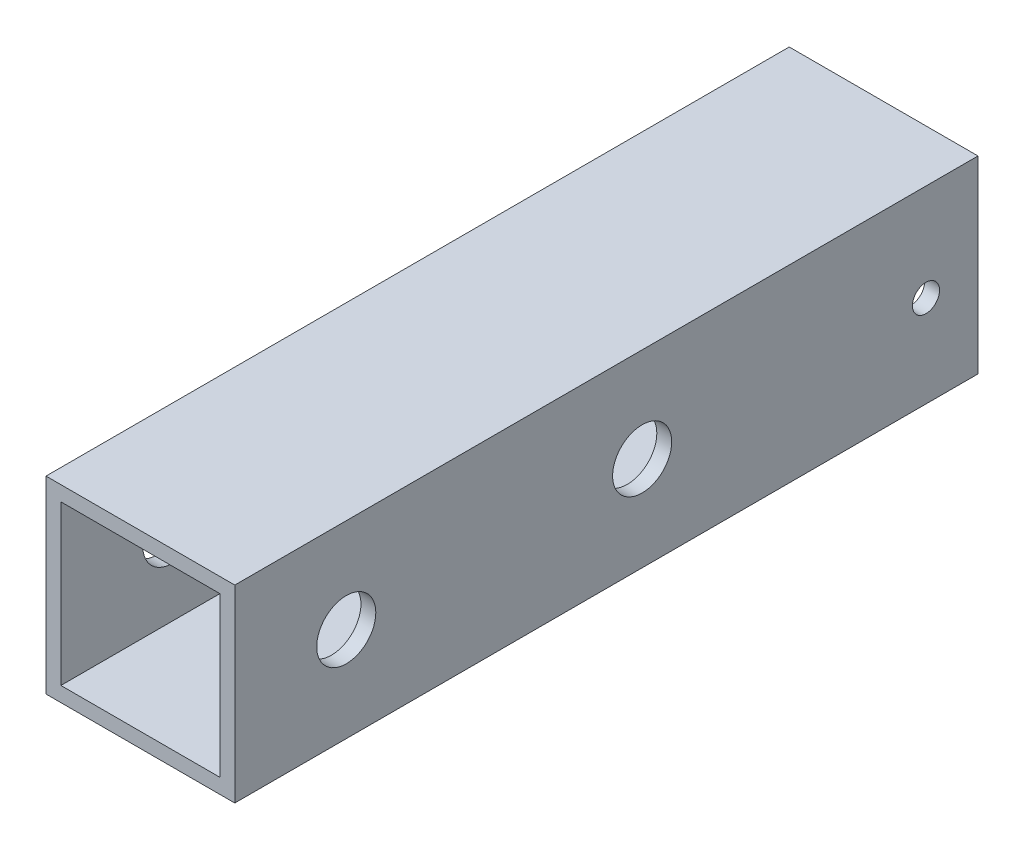
ISO-10303-21;
HEADER;
FILE_DESCRIPTION(('STEP AP214'),'2;1');
FILE_NAME('part.step','',(''),(''),'','','');
FILE_SCHEMA(('AUTOMOTIVE_DESIGN { 1 0 10303 214 1 1 1 1 }'));
ENDSEC;
DATA;
#1=APPLICATION_CONTEXT('core data for automotive mechanical design processes');
#2=APPLICATION_PROTOCOL_DEFINITION('international standard','automotive_design',2000,#1);
#3=PRODUCT_CONTEXT('',#1,'mechanical');
#4=PRODUCT('Part','Part','',(#3));
#5=PRODUCT_RELATED_PRODUCT_CATEGORY('part','',(#4));
#6=PRODUCT_DEFINITION_FORMATION('','',#4);
#7=PRODUCT_DEFINITION_CONTEXT('part definition',#1,'design');
#8=PRODUCT_DEFINITION('design','',#6,#7);
#9=PRODUCT_DEFINITION_SHAPE('','',#8);
#10=(LENGTH_UNIT() NAMED_UNIT(*) SI_UNIT(.MILLI.,.METRE.));
#11=(NAMED_UNIT(*) PLANE_ANGLE_UNIT() SI_UNIT($,.RADIAN.));
#12=(NAMED_UNIT(*) SI_UNIT($,.STERADIAN.) SOLID_ANGLE_UNIT());
#13=UNCERTAINTY_MEASURE_WITH_UNIT(LENGTH_MEASURE(1.E-05),#10,'distance_accuracy_value','');
#14=(GEOMETRIC_REPRESENTATION_CONTEXT(3) GLOBAL_UNCERTAINTY_ASSIGNED_CONTEXT((#13)) GLOBAL_UNIT_ASSIGNED_CONTEXT((#10,
#11,#12)) REPRESENTATION_CONTEXT('',''));
#15=CARTESIAN_POINT('',(0.,0.,0.));
#16=DIRECTION('',(0.,0.,1.));
#17=DIRECTION('',(1.,0.,0.));
#18=AXIS2_PLACEMENT_3D('',#15,#16,#17);
#19=CARTESIAN_POINT('',(0.,0.,100.));
#20=DIRECTION('',(0.,1.,0.));
#21=DIRECTION('',(0.,0.,1.));
#22=AXIS2_PLACEMENT_3D('',#19,#20,#21);
#23=PLANE('',#22);
#24=CARTESIAN_POINT('',(17.5,0.,2.76572977132498));
#25=DIRECTION('',(0.,-1.,0.));
#26=DIRECTION('',(0.,0.,-1.));
#27=AXIS2_PLACEMENT_3D('',#24,#25,#26);
#28=CIRCLE('',#27,1.778);
#29=CARTESIAN_POINT('',(17.5,0.,0.987729771324982));
#30=VERTEX_POINT('',#29);
#31=EDGE_CURVE('E246',#30,#30,#28,.T.);
#32=ORIENTED_EDGE('',*,*,#31,.F.);
#33=EDGE_LOOP('',(#32));
#34=FACE_BOUND('',#33,.T.);
#35=CARTESIAN_POINT('',(7.50000000000003,0.,2.76572977132497));
#36=DIRECTION('',(0.,-1.,0.));
#37=DIRECTION('',(0.,0.,-1.));
#38=AXIS2_PLACEMENT_3D('',#35,#36,#37);
#39=CIRCLE('',#38,1.778);
#40=CARTESIAN_POINT('',(7.50000000000003,0.,0.987729771324969));
#41=VERTEX_POINT('',#40);
#42=EDGE_CURVE('E243',#41,#41,#39,.T.);
#43=ORIENTED_EDGE('',*,*,#42,.F.);
#44=EDGE_LOOP('',(#43));
#45=FACE_BOUND('',#44,.T.);
#46=DIRECTION('',(1.,0.,0.));
#47=VECTOR('',#46,1.);
#48=CARTESIAN_POINT('',(0.,0.,0.));
#49=LINE('',#48,#47);
#50=CARTESIAN_POINT('',(0.,0.,0.));
#51=VERTEX_POINT('',#50);
#52=CARTESIAN_POINT('',(25.4,0.,0.));
#53=VERTEX_POINT('',#52);
#54=EDGE_CURVE('E217',#51,#53,#49,.T.);
#55=ORIENTED_EDGE('',*,*,#54,.T.);
#56=DIRECTION('',(0.,0.,-1.));
#57=VECTOR('',#56,1.);
#58=CARTESIAN_POINT('',(25.4,0.,100.));
#59=LINE('',#58,#57);
#60=CARTESIAN_POINT('',(25.4,0.,100.));
#61=VERTEX_POINT('',#60);
#62=EDGE_CURVE('E227',#61,#53,#59,.T.);
#63=ORIENTED_EDGE('',*,*,#62,.F.);
#64=DIRECTION('',(1.,0.,0.));
#65=VECTOR('',#64,1.);
#66=CARTESIAN_POINT('',(0.,0.,100.));
#67=LINE('',#66,#65);
#68=CARTESIAN_POINT('',(0.,0.,100.));
#69=VERTEX_POINT('',#68);
#70=EDGE_CURVE('E207',#69,#61,#67,.T.);
#71=ORIENTED_EDGE('',*,*,#70,.F.);
#72=DIRECTION('',(0.,0.,-1.));
#73=VECTOR('',#72,1.);
#74=CARTESIAN_POINT('',(0.,0.,100.));
#75=LINE('',#74,#73);
#76=EDGE_CURVE('E230',#69,#51,#75,.T.);
#77=ORIENTED_EDGE('',*,*,#76,.T.);
#78=EDGE_LOOP('',(#55,#63,#71,#77));
#79=FACE_BOUND('',#78,.T.);
#80=DIRECTION('',(0.,0.,1.));
#81=VECTOR('',#80,1.);
#82=CARTESIAN_POINT('',(5.35,0.,0.));
#83=LINE('',#82,#81);
#84=CARTESIAN_POINT('',(5.35,0.,10.));
#85=VERTEX_POINT('',#84);
#86=CARTESIAN_POINT('',(5.35000000000001,0.,70.));
#87=VERTEX_POINT('',#86);
#88=EDGE_CURVE('E52',#85,#87,#83,.T.);
#89=ORIENTED_EDGE('',*,*,#88,.T.);
#90=CARTESIAN_POINT('',(6.9,0.,70.));
#91=DIRECTION('',(0.,-1.,0.));
#92=DIRECTION('',(0.,0.,-1.));
#93=AXIS2_PLACEMENT_3D('',#90,#91,#92);
#94=CIRCLE('',#93,1.54999999999999);
#95=CARTESIAN_POINT('',(8.44999999999999,0.,70.));
#96=VERTEX_POINT('',#95);
#97=EDGE_CURVE('E143',#96,#87,#94,.T.);
#98=ORIENTED_EDGE('',*,*,#97,.F.);
#99=DIRECTION('',(0.,0.,-1.));
#100=VECTOR('',#99,1.);
#101=CARTESIAN_POINT('',(8.45,0.,0.));
#102=LINE('',#101,#100);
#103=CARTESIAN_POINT('',(8.45,0.,10.));
#104=VERTEX_POINT('',#103);
#105=EDGE_CURVE('E129',#96,#104,#102,.T.);
#106=ORIENTED_EDGE('',*,*,#105,.T.);
#107=CARTESIAN_POINT('',(6.9,0.,10.));
#108=DIRECTION('',(0.,-1.,0.));
#109=DIRECTION('',(0.,0.,-1.));
#110=AXIS2_PLACEMENT_3D('',#107,#108,#109);
#111=CIRCLE('',#110,1.55);
#112=EDGE_CURVE('E138',#85,#104,#111,.T.);
#113=ORIENTED_EDGE('',*,*,#112,.F.);
#114=EDGE_LOOP('',(#89,#98,#106,#113));
#115=FACE_BOUND('',#114,.T.);
#116=ADVANCED_FACE('F35',(#34,#45,#79,#115),#23,.F.);
#117=CARTESIAN_POINT('',(2.,2.,100.));
#118=DIRECTION('',(0.,1.,0.));
#119=DIRECTION('',(0.,0.,1.));
#120=AXIS2_PLACEMENT_3D('',#117,#118,#119);
#121=PLANE('',#120);
#122=CARTESIAN_POINT('',(17.5,2.,2.76572977132498));
#123=DIRECTION('',(0.,1.,0.));
#124=DIRECTION('',(0.,0.,1.));
#125=AXIS2_PLACEMENT_3D('',#122,#123,#124);
#126=CIRCLE('',#125,1.778);
#127=CARTESIAN_POINT('',(17.5,2.,4.54372977132498));
#128=VERTEX_POINT('',#127);
#129=EDGE_CURVE('E244',#128,#128,#126,.T.);
#130=ORIENTED_EDGE('',*,*,#129,.F.);
#131=EDGE_LOOP('',(#130));
#132=FACE_BOUND('',#131,.T.);
#133=CARTESIAN_POINT('',(7.50000000000003,2.,2.76572977132497));
#134=DIRECTION('',(0.,1.,0.));
#135=DIRECTION('',(0.,0.,1.));
#136=AXIS2_PLACEMENT_3D('',#133,#134,#135);
#137=CIRCLE('',#136,1.778);
#138=CARTESIAN_POINT('',(7.50000000000003,2.,4.54372977132497));
#139=VERTEX_POINT('',#138);
#140=EDGE_CURVE('E241',#139,#139,#137,.T.);
#141=ORIENTED_EDGE('',*,*,#140,.F.);
#142=EDGE_LOOP('',(#141));
#143=FACE_BOUND('',#142,.T.);
#144=DIRECTION('',(1.,0.,0.));
#145=VECTOR('',#144,1.);
#146=CARTESIAN_POINT('',(2.,2.,0.));
#147=LINE('',#146,#145);
#148=CARTESIAN_POINT('',(2.,2.,0.));
#149=VERTEX_POINT('',#148);
#150=CARTESIAN_POINT('',(23.4,2.,0.));
#151=VERTEX_POINT('',#150);
#152=EDGE_CURVE('E186',#149,#151,#147,.T.);
#153=ORIENTED_EDGE('',*,*,#152,.F.);
#154=DIRECTION('',(0.,0.,-1.));
#155=VECTOR('',#154,1.);
#156=CARTESIAN_POINT('',(2.,2.,100.));
#157=LINE('',#156,#155);
#158=CARTESIAN_POINT('',(2.,2.,100.));
#159=VERTEX_POINT('',#158);
#160=EDGE_CURVE('E200',#159,#149,#157,.T.);
#161=ORIENTED_EDGE('',*,*,#160,.F.);
#162=DIRECTION('',(1.,0.,0.));
#163=VECTOR('',#162,1.);
#164=CARTESIAN_POINT('',(2.,2.,100.));
#165=LINE('',#164,#163);
#166=CARTESIAN_POINT('',(23.4,2.,100.));
#167=VERTEX_POINT('',#166);
#168=EDGE_CURVE('E175',#159,#167,#165,.T.);
#169=ORIENTED_EDGE('',*,*,#168,.T.);
#170=DIRECTION('',(0.,0.,-1.));
#171=VECTOR('',#170,1.);
#172=CARTESIAN_POINT('',(23.4,2.,100.));
#173=LINE('',#172,#171);
#174=EDGE_CURVE('E198',#167,#151,#173,.T.);
#175=ORIENTED_EDGE('',*,*,#174,.T.);
#176=EDGE_LOOP('',(#153,#161,#169,#175));
#177=FACE_BOUND('',#176,.T.);
#178=CARTESIAN_POINT('',(6.9,2.,70.));
#179=DIRECTION('',(0.,1.,0.));
#180=DIRECTION('',(0.,0.,1.));
#181=AXIS2_PLACEMENT_3D('',#178,#179,#180);
#182=CIRCLE('',#181,1.54999999999999);
#183=CARTESIAN_POINT('',(5.35000000000001,2.,70.));
#184=VERTEX_POINT('',#183);
#185=CARTESIAN_POINT('',(8.44999999999999,2.,70.));
#186=VERTEX_POINT('',#185);
#187=EDGE_CURVE('E44',#184,#186,#182,.T.);
#188=ORIENTED_EDGE('',*,*,#187,.F.);
#189=DIRECTION('',(0.,0.,-1.));
#190=VECTOR('',#189,1.);
#191=CARTESIAN_POINT('',(5.35000000000001,2.,100.));
#192=LINE('',#191,#190);
#193=CARTESIAN_POINT('',(5.35,2.,10.));
#194=VERTEX_POINT('',#193);
#195=EDGE_CURVE('E11',#184,#194,#192,.T.);
#196=ORIENTED_EDGE('',*,*,#195,.T.);
#197=CARTESIAN_POINT('',(6.9,2.,10.));
#198=DIRECTION('',(0.,1.,0.));
#199=DIRECTION('',(0.,0.,1.));
#200=AXIS2_PLACEMENT_3D('',#197,#198,#199);
#201=CIRCLE('',#200,1.55);
#202=CARTESIAN_POINT('',(8.45,2.,10.));
#203=VERTEX_POINT('',#202);
#204=EDGE_CURVE('E233',#203,#194,#201,.T.);
#205=ORIENTED_EDGE('',*,*,#204,.F.);
#206=DIRECTION('',(0.,0.,1.));
#207=VECTOR('',#206,1.);
#208=CARTESIAN_POINT('',(8.44999999999999,2.,100.));
#209=LINE('',#208,#207);
#210=EDGE_CURVE('E132',#203,#186,#209,.T.);
#211=ORIENTED_EDGE('',*,*,#210,.T.);
#212=EDGE_LOOP('',(#188,#196,#205,#211));
#213=FACE_BOUND('',#212,.T.);
#214=ADVANCED_FACE('F307',(#132,#143,#177,#213),#121,.T.);
#215=CARTESIAN_POINT('',(0.,0.,100.));
#216=DIRECTION('',(0.,0.,-1.));
#217=DIRECTION('',(-1.,0.,0.));
#218=AXIS2_PLACEMENT_3D('',#215,#216,#217);
#219=PLANE('',#218);
#220=DIRECTION('',(0.,-1.,0.));
#221=VECTOR('',#220,1.);
#222=CARTESIAN_POINT('',(0.,0.,100.));
#223=LINE('',#222,#221);
#224=CARTESIAN_POINT('',(0.,25.4,100.));
#225=VERTEX_POINT('',#224);
#226=EDGE_CURVE('E204',#225,#69,#223,.T.);
#227=ORIENTED_EDGE('',*,*,#226,.T.);
#228=ORIENTED_EDGE('',*,*,#70,.T.);
#229=DIRECTION('',(0.,1.,0.));
#230=VECTOR('',#229,1.);
#231=CARTESIAN_POINT('',(25.4,0.,100.));
#232=LINE('',#231,#230);
#233=CARTESIAN_POINT('',(25.4,25.4,100.));
#234=VERTEX_POINT('',#233);
#235=EDGE_CURVE('E210',#61,#234,#232,.T.);
#236=ORIENTED_EDGE('',*,*,#235,.T.);
#237=DIRECTION('',(-1.,0.,0.));
#238=VECTOR('',#237,1.);
#239=CARTESIAN_POINT('',(0.,25.4,100.));
#240=LINE('',#239,#238);
#241=EDGE_CURVE('E212',#234,#225,#240,.T.);
#242=ORIENTED_EDGE('',*,*,#241,.T.);
#243=EDGE_LOOP('',(#227,#228,#236,#242));
#244=FACE_BOUND('',#243,.T.);
#245=DIRECTION('',(0.,-1.,0.));
#246=VECTOR('',#245,1.);
#247=CARTESIAN_POINT('',(2.,23.4,100.));
#248=LINE('',#247,#246);
#249=CARTESIAN_POINT('',(2.,23.4,100.));
#250=VERTEX_POINT('',#249);
#251=EDGE_CURVE('E173',#250,#159,#248,.T.);
#252=ORIENTED_EDGE('',*,*,#251,.F.);
#253=DIRECTION('',(-1.,0.,0.));
#254=VECTOR('',#253,1.);
#255=CARTESIAN_POINT('',(2.,23.4,100.));
#256=LINE('',#255,#254);
#257=CARTESIAN_POINT('',(23.4,23.4,100.));
#258=VERTEX_POINT('',#257);
#259=EDGE_CURVE('E181',#258,#250,#256,.T.);
#260=ORIENTED_EDGE('',*,*,#259,.F.);
#261=DIRECTION('',(0.,1.,0.));
#262=VECTOR('',#261,1.);
#263=CARTESIAN_POINT('',(23.4,23.4,100.));
#264=LINE('',#263,#262);
#265=EDGE_CURVE('E178',#167,#258,#264,.T.);
#266=ORIENTED_EDGE('',*,*,#265,.F.);
#267=ORIENTED_EDGE('',*,*,#168,.F.);
#268=EDGE_LOOP('',(#252,#260,#266,#267));
#269=FACE_BOUND('',#268,.T.);
#270=ADVANCED_FACE('F288',(#244,#269),#219,.F.);
#271=CARTESIAN_POINT('',(0.,0.,0.));
#272=DIRECTION('',(0.,0.,-1.));
#273=DIRECTION('',(-1.,0.,0.));
#274=AXIS2_PLACEMENT_3D('',#271,#272,#273);
#275=PLANE('',#274);
#276=DIRECTION('',(0.,-1.,0.));
#277=VECTOR('',#276,1.);
#278=CARTESIAN_POINT('',(0.,0.,0.));
#279=LINE('',#278,#277);
#280=CARTESIAN_POINT('',(0.,25.4,0.));
#281=VERTEX_POINT('',#280);
#282=EDGE_CURVE('E203',#281,#51,#279,.T.);
#283=ORIENTED_EDGE('',*,*,#282,.F.);
#284=DIRECTION('',(-1.,0.,0.));
#285=VECTOR('',#284,1.);
#286=CARTESIAN_POINT('',(0.,25.4,0.));
#287=LINE('',#286,#285);
#288=CARTESIAN_POINT('',(25.4,25.4,0.));
#289=VERTEX_POINT('',#288);
#290=EDGE_CURVE('E208',#289,#281,#287,.T.);
#291=ORIENTED_EDGE('',*,*,#290,.F.);
#292=DIRECTION('',(0.,1.,0.));
#293=VECTOR('',#292,1.);
#294=CARTESIAN_POINT('',(25.4,0.,0.));
#295=LINE('',#294,#293);
#296=EDGE_CURVE('E219',#53,#289,#295,.T.);
#297=ORIENTED_EDGE('',*,*,#296,.F.);
#298=ORIENTED_EDGE('',*,*,#54,.F.);
#299=EDGE_LOOP('',(#283,#291,#297,#298));
#300=FACE_BOUND('',#299,.T.);
#301=DIRECTION('',(-1.,0.,0.));
#302=VECTOR('',#301,1.);
#303=CARTESIAN_POINT('',(2.,23.4,0.));
#304=LINE('',#303,#302);
#305=CARTESIAN_POINT('',(23.4,23.4,0.));
#306=VERTEX_POINT('',#305);
#307=CARTESIAN_POINT('',(2.,23.4,0.));
#308=VERTEX_POINT('',#307);
#309=EDGE_CURVE('E176',#306,#308,#304,.T.);
#310=ORIENTED_EDGE('',*,*,#309,.T.);
#311=DIRECTION('',(0.,-1.,0.));
#312=VECTOR('',#311,1.);
#313=CARTESIAN_POINT('',(2.,23.4,0.));
#314=LINE('',#313,#312);
#315=EDGE_CURVE('E172',#308,#149,#314,.T.);
#316=ORIENTED_EDGE('',*,*,#315,.T.);
#317=ORIENTED_EDGE('',*,*,#152,.T.);
#318=DIRECTION('',(0.,1.,0.));
#319=VECTOR('',#318,1.);
#320=CARTESIAN_POINT('',(23.4,23.4,0.));
#321=LINE('',#320,#319);
#322=EDGE_CURVE('E189',#151,#306,#321,.T.);
#323=ORIENTED_EDGE('',*,*,#322,.T.);
#324=EDGE_LOOP('',(#310,#316,#317,#323));
#325=FACE_BOUND('',#324,.T.);
#326=ADVANCED_FACE('F271',(#300,#325),#275,.T.);
#327=CARTESIAN_POINT('',(0.,0.,100.));
#328=DIRECTION('',(1.,0.,0.));
#329=DIRECTION('',(0.,0.,-1.));
#330=AXIS2_PLACEMENT_3D('',#327,#328,#329);
#331=PLANE('',#330);
#332=CARTESIAN_POINT('',(0.,12.3501929290579,7.));
#333=DIRECTION('',(-1.,0.,0.));
#334=DIRECTION('',(0.,0.,1.));
#335=AXIS2_PLACEMENT_3D('',#332,#333,#334);
#336=CIRCLE('',#335,1.825);
#337=CARTESIAN_POINT('',(0.,12.3501929290579,8.825));
#338=VERTEX_POINT('',#337);
#339=EDGE_CURVE('E262',#338,#338,#336,.T.);
#340=ORIENTED_EDGE('',*,*,#339,.F.);
#341=EDGE_LOOP('',(#340));
#342=FACE_BOUND('',#341,.T.);
#343=CARTESIAN_POINT('',(0.,12.7,45.19));
#344=DIRECTION('',(1.,0.,0.));
#345=DIRECTION('',(0.,0.,-1.));
#346=AXIS2_PLACEMENT_3D('',#343,#344,#345);
#347=CIRCLE('',#346,3.97500000000001);
#348=CARTESIAN_POINT('',(0.,12.7,41.215));
#349=VERTEX_POINT('',#348);
#350=EDGE_CURVE('E159',#349,#349,#347,.T.);
#351=ORIENTED_EDGE('',*,*,#350,.T.);
#352=EDGE_LOOP('',(#351));
#353=FACE_BOUND('',#352,.T.);
#354=CARTESIAN_POINT('',(0.,12.7,85.));
#355=DIRECTION('',(1.,0.,0.));
#356=DIRECTION('',(0.,0.,-1.));
#357=AXIS2_PLACEMENT_3D('',#354,#355,#356);
#358=CIRCLE('',#357,3.97500000000001);
#359=CARTESIAN_POINT('',(0.,12.7,81.025));
#360=VERTEX_POINT('',#359);
#361=EDGE_CURVE('E169',#360,#360,#358,.T.);
#362=ORIENTED_EDGE('',*,*,#361,.T.);
#363=EDGE_LOOP('',(#362));
#364=FACE_BOUND('',#363,.T.);
#365=ORIENTED_EDGE('',*,*,#282,.T.);
#366=ORIENTED_EDGE('',*,*,#76,.F.);
#367=ORIENTED_EDGE('',*,*,#226,.F.);
#368=DIRECTION('',(0.,0.,-1.));
#369=VECTOR('',#368,1.);
#370=CARTESIAN_POINT('',(0.,25.4,100.));
#371=LINE('',#370,#369);
#372=EDGE_CURVE('E214',#225,#281,#371,.T.);
#373=ORIENTED_EDGE('',*,*,#372,.T.);
#374=EDGE_LOOP('',(#365,#366,#367,#373));
#375=FACE_BOUND('',#374,.T.);
#376=ADVANCED_FACE('F37',(#342,#353,#364,#375),#331,.F.);
#377=CARTESIAN_POINT('',(25.4,0.,100.));
#378=DIRECTION('',(-1.,0.,0.));
#379=DIRECTION('',(0.,0.,1.));
#380=AXIS2_PLACEMENT_3D('',#377,#378,#379);
#381=PLANE('',#380);
#382=CARTESIAN_POINT('',(25.4,12.3501929290579,7.));
#383=DIRECTION('',(-1.,0.,0.));
#384=DIRECTION('',(0.,0.,1.));
#385=AXIS2_PLACEMENT_3D('',#382,#383,#384);
#386=CIRCLE('',#385,1.825);
#387=CARTESIAN_POINT('',(25.4,12.3501929290579,8.825));
#388=VERTEX_POINT('',#387);
#389=EDGE_CURVE('E259',#388,#388,#386,.F.);
#390=ORIENTED_EDGE('',*,*,#389,.F.);
#391=EDGE_LOOP('',(#390));
#392=FACE_BOUND('',#391,.T.);
#393=CARTESIAN_POINT('',(25.4,12.7,45.19));
#394=DIRECTION('',(1.,0.,0.));
#395=DIRECTION('',(0.,0.,-1.));
#396=AXIS2_PLACEMENT_3D('',#393,#394,#395);
#397=CIRCLE('',#396,3.97500000000001);
#398=CARTESIAN_POINT('',(25.4,12.7,41.215));
#399=VERTEX_POINT('',#398);
#400=EDGE_CURVE('E150',#399,#399,#397,.T.);
#401=ORIENTED_EDGE('',*,*,#400,.F.);
#402=EDGE_LOOP('',(#401));
#403=FACE_BOUND('',#402,.T.);
#404=CARTESIAN_POINT('',(25.4,12.7,85.));
#405=DIRECTION('',(1.,0.,0.));
#406=DIRECTION('',(0.,0.,-1.));
#407=AXIS2_PLACEMENT_3D('',#404,#405,#406);
#408=CIRCLE('',#407,3.97500000000001);
#409=CARTESIAN_POINT('',(25.4,12.7,81.025));
#410=VERTEX_POINT('',#409);
#411=EDGE_CURVE('E162',#410,#410,#408,.T.);
#412=ORIENTED_EDGE('',*,*,#411,.F.);
#413=EDGE_LOOP('',(#412));
#414=FACE_BOUND('',#413,.T.);
#415=ORIENTED_EDGE('',*,*,#296,.T.);
#416=DIRECTION('',(0.,0.,-1.));
#417=VECTOR('',#416,1.);
#418=CARTESIAN_POINT('',(25.4,25.4,100.));
#419=LINE('',#418,#417);
#420=EDGE_CURVE('E224',#234,#289,#419,.T.);
#421=ORIENTED_EDGE('',*,*,#420,.F.);
#422=ORIENTED_EDGE('',*,*,#235,.F.);
#423=ORIENTED_EDGE('',*,*,#62,.T.);
#424=EDGE_LOOP('',(#415,#421,#422,#423));
#425=FACE_BOUND('',#424,.T.);
#426=ADVANCED_FACE('F270',(#392,#403,#414,#425),#381,.F.);
#427=CARTESIAN_POINT('',(0.,25.4,100.));
#428=DIRECTION('',(0.,-1.,0.));
#429=DIRECTION('',(0.,0.,-1.));
#430=AXIS2_PLACEMENT_3D('',#427,#428,#429);
#431=PLANE('',#430);
#432=ORIENTED_EDGE('',*,*,#290,.T.);
#433=ORIENTED_EDGE('',*,*,#372,.F.);
#434=ORIENTED_EDGE('',*,*,#241,.F.);
#435=ORIENTED_EDGE('',*,*,#420,.T.);
#436=EDGE_LOOP('',(#432,#433,#434,#435));
#437=FACE_BOUND('',#436,.T.);
#438=ADVANCED_FACE('F293',(#437),#431,.F.);
#439=CARTESIAN_POINT('',(2.,23.4,100.));
#440=DIRECTION('',(1.,0.,0.));
#441=DIRECTION('',(0.,1.,0.));
#442=AXIS2_PLACEMENT_3D('',#439,#440,#441);
#443=PLANE('',#442);
#444=CARTESIAN_POINT('',(2.,12.3501929290579,7.));
#445=DIRECTION('',(1.,0.,0.));
#446=DIRECTION('',(0.,1.,0.));
#447=AXIS2_PLACEMENT_3D('',#444,#445,#446);
#448=CIRCLE('',#447,1.825);
#449=CARTESIAN_POINT('',(2.,14.1751929290579,7.));
#450=VERTEX_POINT('',#449);
#451=EDGE_CURVE('E252',#450,#450,#448,.T.);
#452=ORIENTED_EDGE('',*,*,#451,.F.);
#453=EDGE_LOOP('',(#452));
#454=FACE_BOUND('',#453,.T.);
#455=CARTESIAN_POINT('',(2.,12.7,45.19));
#456=DIRECTION('',(1.,0.,0.));
#457=DIRECTION('',(0.,1.,0.));
#458=AXIS2_PLACEMENT_3D('',#455,#456,#457);
#459=CIRCLE('',#458,3.97500000000001);
#460=CARTESIAN_POINT('',(2.,16.675,45.19));
#461=VERTEX_POINT('',#460);
#462=EDGE_CURVE('E156',#461,#461,#459,.T.);
#463=ORIENTED_EDGE('',*,*,#462,.F.);
#464=EDGE_LOOP('',(#463));
#465=FACE_BOUND('',#464,.T.);
#466=CARTESIAN_POINT('',(2.,12.7,85.));
#467=DIRECTION('',(1.,0.,0.));
#468=DIRECTION('',(0.,1.,0.));
#469=AXIS2_PLACEMENT_3D('',#466,#467,#468);
#470=CIRCLE('',#469,3.97500000000001);
#471=CARTESIAN_POINT('',(2.,16.675,85.));
#472=VERTEX_POINT('',#471);
#473=EDGE_CURVE('E166',#472,#472,#470,.T.);
#474=ORIENTED_EDGE('',*,*,#473,.F.);
#475=EDGE_LOOP('',(#474));
#476=FACE_BOUND('',#475,.T.);
#477=ORIENTED_EDGE('',*,*,#315,.F.);
#478=DIRECTION('',(0.,0.,-1.));
#479=VECTOR('',#478,1.);
#480=CARTESIAN_POINT('',(2.,23.4,100.));
#481=LINE('',#480,#479);
#482=EDGE_CURVE('E183',#250,#308,#481,.T.);
#483=ORIENTED_EDGE('',*,*,#482,.F.);
#484=ORIENTED_EDGE('',*,*,#251,.T.);
#485=ORIENTED_EDGE('',*,*,#160,.T.);
#486=EDGE_LOOP('',(#477,#483,#484,#485));
#487=FACE_BOUND('',#486,.T.);
#488=ADVANCED_FACE('F302',(#454,#465,#476,#487),#443,.T.);
#489=CARTESIAN_POINT('',(23.4,23.4,100.));
#490=DIRECTION('',(-1.,0.,0.));
#491=DIRECTION('',(0.,-1.,0.));
#492=AXIS2_PLACEMENT_3D('',#489,#490,#491);
#493=PLANE('',#492);
#494=CARTESIAN_POINT('',(23.4,12.3501929290579,7.));
#495=DIRECTION('',(-1.,0.,0.));
#496=DIRECTION('',(0.,-1.,0.));
#497=AXIS2_PLACEMENT_3D('',#494,#495,#496);
#498=CIRCLE('',#497,1.825);
#499=CARTESIAN_POINT('',(23.4,10.5251929290579,7.));
#500=VERTEX_POINT('',#499);
#501=EDGE_CURVE('E39',#500,#500,#498,.T.);
#502=ORIENTED_EDGE('',*,*,#501,.F.);
#503=EDGE_LOOP('',(#502));
#504=FACE_BOUND('',#503,.T.);
#505=CARTESIAN_POINT('',(23.4,12.7,45.19));
#506=DIRECTION('',(-1.,0.,0.));
#507=DIRECTION('',(0.,-1.,0.));
#508=AXIS2_PLACEMENT_3D('',#505,#506,#507);
#509=CIRCLE('',#508,3.97500000000001);
#510=CARTESIAN_POINT('',(23.4,8.72499999999998,45.19));
#511=VERTEX_POINT('',#510);
#512=EDGE_CURVE('E155',#511,#511,#509,.T.);
#513=ORIENTED_EDGE('',*,*,#512,.F.);
#514=EDGE_LOOP('',(#513));
#515=FACE_BOUND('',#514,.T.);
#516=CARTESIAN_POINT('',(23.4,12.7,85.));
#517=DIRECTION('',(-1.,0.,0.));
#518=DIRECTION('',(0.,-1.,0.));
#519=AXIS2_PLACEMENT_3D('',#516,#517,#518);
#520=CIRCLE('',#519,3.97500000000001);
#521=CARTESIAN_POINT('',(23.4,8.72499999999999,85.));
#522=VERTEX_POINT('',#521);
#523=EDGE_CURVE('E165',#522,#522,#520,.T.);
#524=ORIENTED_EDGE('',*,*,#523,.F.);
#525=EDGE_LOOP('',(#524));
#526=FACE_BOUND('',#525,.T.);
#527=ORIENTED_EDGE('',*,*,#322,.F.);
#528=ORIENTED_EDGE('',*,*,#174,.F.);
#529=ORIENTED_EDGE('',*,*,#265,.T.);
#530=DIRECTION('',(0.,0.,-1.));
#531=VECTOR('',#530,1.);
#532=CARTESIAN_POINT('',(23.4,23.4,100.));
#533=LINE('',#532,#531);
#534=EDGE_CURVE('E196',#258,#306,#533,.T.);
#535=ORIENTED_EDGE('',*,*,#534,.T.);
#536=EDGE_LOOP('',(#527,#528,#529,#535));
#537=FACE_BOUND('',#536,.T.);
#538=ADVANCED_FACE('F354',(#504,#515,#526,#537),#493,.T.);
#539=CARTESIAN_POINT('',(2.,23.4,100.));
#540=DIRECTION('',(0.,-1.,0.));
#541=DIRECTION('',(0.,0.,-1.));
#542=AXIS2_PLACEMENT_3D('',#539,#540,#541);
#543=PLANE('',#542);
#544=ORIENTED_EDGE('',*,*,#309,.F.);
#545=ORIENTED_EDGE('',*,*,#534,.F.);
#546=ORIENTED_EDGE('',*,*,#259,.T.);
#547=ORIENTED_EDGE('',*,*,#482,.T.);
#548=EDGE_LOOP('',(#544,#545,#546,#547));
#549=FACE_BOUND('',#548,.T.);
#550=ADVANCED_FACE('F350',(#549),#543,.T.);
#551=CARTESIAN_POINT('',(-24.6,12.7,85.));
#552=DIRECTION('',(1.,0.,0.));
#553=DIRECTION('',(0.,0.,-1.));
#554=AXIS2_PLACEMENT_3D('',#551,#552,#553);
#555=CYLINDRICAL_SURFACE('',#554,3.97500000000001);
#556=ORIENTED_EDGE('',*,*,#523,.T.);
#557=EDGE_LOOP('',(#556));
#558=FACE_BOUND('',#557,.T.);
#559=ORIENTED_EDGE('',*,*,#411,.T.);
#560=EDGE_LOOP('',(#559));
#561=FACE_BOUND('',#560,.T.);
#562=ADVANCED_FACE('F347',(#558,#561),#555,.F.);
#563=ORIENTED_EDGE('',*,*,#473,.T.);
#564=EDGE_LOOP('',(#563));
#565=FACE_BOUND('',#564,.T.);
#566=ORIENTED_EDGE('',*,*,#361,.F.);
#567=EDGE_LOOP('',(#566));
#568=FACE_BOUND('',#567,.T.);
#569=ADVANCED_FACE('F345',(#565,#568),#555,.F.);
#570=CARTESIAN_POINT('',(-24.6,12.7,45.19));
#571=DIRECTION('',(1.,0.,0.));
#572=DIRECTION('',(0.,0.,-1.));
#573=AXIS2_PLACEMENT_3D('',#570,#571,#572);
#574=CYLINDRICAL_SURFACE('',#573,3.97500000000001);
#575=ORIENTED_EDGE('',*,*,#512,.T.);
#576=EDGE_LOOP('',(#575));
#577=FACE_BOUND('',#576,.T.);
#578=ORIENTED_EDGE('',*,*,#400,.T.);
#579=EDGE_LOOP('',(#578));
#580=FACE_BOUND('',#579,.T.);
#581=ADVANCED_FACE('F342',(#577,#580),#574,.F.);
#582=ORIENTED_EDGE('',*,*,#462,.T.);
#583=EDGE_LOOP('',(#582));
#584=FACE_BOUND('',#583,.T.);
#585=ORIENTED_EDGE('',*,*,#350,.F.);
#586=EDGE_LOOP('',(#585));
#587=FACE_BOUND('',#586,.T.);
#588=ADVANCED_FACE('F341',(#584,#587),#574,.F.);
#589=CARTESIAN_POINT('',(5.35,10.,0.));
#590=DIRECTION('',(1.,0.,0.));
#591=DIRECTION('',(0.,0.,-1.));
#592=AXIS2_PLACEMENT_3D('',#589,#590,#591);
#593=PLANE('',#592);
#594=DIRECTION('',(0.,-1.,0.));
#595=VECTOR('',#594,1.);
#596=CARTESIAN_POINT('',(5.35000000000001,10.,70.));
#597=LINE('',#596,#595);
#598=EDGE_CURVE('E148',#184,#87,#597,.T.);
#599=ORIENTED_EDGE('',*,*,#598,.T.);
#600=ORIENTED_EDGE('',*,*,#88,.F.);
#601=DIRECTION('',(0.,-1.,0.));
#602=VECTOR('',#601,1.);
#603=CARTESIAN_POINT('',(5.35,10.,10.));
#604=LINE('',#603,#602);
#605=EDGE_CURVE('E135',#194,#85,#604,.T.);
#606=ORIENTED_EDGE('',*,*,#605,.F.);
#607=ORIENTED_EDGE('',*,*,#195,.F.);
#608=EDGE_LOOP('',(#599,#600,#606,#607));
#609=FACE_BOUND('',#608,.T.);
#610=ADVANCED_FACE('F335',(#609),#593,.T.);
#611=CARTESIAN_POINT('',(6.9,10.,70.));
#612=DIRECTION('',(0.,-1.,0.));
#613=DIRECTION('',(0.,0.,-1.));
#614=AXIS2_PLACEMENT_3D('',#611,#612,#613);
#615=CYLINDRICAL_SURFACE('',#614,1.54999999999999);
#616=ORIENTED_EDGE('',*,*,#187,.T.);
#617=DIRECTION('',(0.,-1.,0.));
#618=VECTOR('',#617,1.);
#619=CARTESIAN_POINT('',(8.44999999999999,10.,70.));
#620=LINE('',#619,#618);
#621=EDGE_CURVE('E134',#186,#96,#620,.T.);
#622=ORIENTED_EDGE('',*,*,#621,.T.);
#623=ORIENTED_EDGE('',*,*,#97,.T.);
#624=ORIENTED_EDGE('',*,*,#598,.F.);
#625=EDGE_LOOP('',(#616,#622,#623,#624));
#626=FACE_BOUND('',#625,.T.);
#627=ADVANCED_FACE('F332',(#626),#615,.F.);
#628=CARTESIAN_POINT('',(8.45,10.,0.));
#629=DIRECTION('',(-1.,0.,0.));
#630=DIRECTION('',(0.,0.,1.));
#631=AXIS2_PLACEMENT_3D('',#628,#629,#630);
#632=PLANE('',#631);
#633=DIRECTION('',(0.,-1.,0.));
#634=VECTOR('',#633,1.);
#635=CARTESIAN_POINT('',(8.45,10.,10.));
#636=LINE('',#635,#634);
#637=EDGE_CURVE('E60',#203,#104,#636,.T.);
#638=ORIENTED_EDGE('',*,*,#637,.T.);
#639=ORIENTED_EDGE('',*,*,#105,.F.);
#640=ORIENTED_EDGE('',*,*,#621,.F.);
#641=ORIENTED_EDGE('',*,*,#210,.F.);
#642=EDGE_LOOP('',(#638,#639,#640,#641));
#643=FACE_BOUND('',#642,.T.);
#644=ADVANCED_FACE('F126',(#643),#632,.T.);
#645=CARTESIAN_POINT('',(6.9,10.,10.));
#646=DIRECTION('',(0.,-1.,0.));
#647=DIRECTION('',(0.,0.,-1.));
#648=AXIS2_PLACEMENT_3D('',#645,#646,#647);
#649=CYLINDRICAL_SURFACE('',#648,1.55);
#650=ORIENTED_EDGE('',*,*,#204,.T.);
#651=ORIENTED_EDGE('',*,*,#605,.T.);
#652=ORIENTED_EDGE('',*,*,#112,.T.);
#653=ORIENTED_EDGE('',*,*,#637,.F.);
#654=EDGE_LOOP('',(#650,#651,#652,#653));
#655=FACE_BOUND('',#654,.T.);
#656=ADVANCED_FACE('F139',(#655),#649,.F.);
#657=CARTESIAN_POINT('',(7.50000000000003,10.,2.76572977132497));
#658=DIRECTION('',(0.,-1.,0.));
#659=DIRECTION('',(0.,0.,-1.));
#660=AXIS2_PLACEMENT_3D('',#657,#658,#659);
#661=CYLINDRICAL_SURFACE('',#660,1.778);
#662=ORIENTED_EDGE('',*,*,#140,.T.);
#663=EDGE_LOOP('',(#662));
#664=FACE_BOUND('',#663,.T.);
#665=ORIENTED_EDGE('',*,*,#42,.T.);
#666=EDGE_LOOP('',(#665));
#667=FACE_BOUND('',#666,.T.);
#668=ADVANCED_FACE('F318',(#664,#667),#661,.F.);
#669=CARTESIAN_POINT('',(17.5,10.,2.76572977132498));
#670=DIRECTION('',(0.,-1.,0.));
#671=DIRECTION('',(0.,0.,-1.));
#672=AXIS2_PLACEMENT_3D('',#669,#670,#671);
#673=CYLINDRICAL_SURFACE('',#672,1.778);
#674=ORIENTED_EDGE('',*,*,#129,.T.);
#675=EDGE_LOOP('',(#674));
#676=FACE_BOUND('',#675,.T.);
#677=ORIENTED_EDGE('',*,*,#31,.T.);
#678=EDGE_LOOP('',(#677));
#679=FACE_BOUND('',#678,.T.);
#680=ADVANCED_FACE('F320',(#676,#679),#673,.F.);
#681=CARTESIAN_POINT('',(30.5618795026618,12.3501929290579,7.));
#682=DIRECTION('',(-1.,0.,0.));
#683=DIRECTION('',(0.,0.,1.));
#684=AXIS2_PLACEMENT_3D('',#681,#682,#683);
#685=CYLINDRICAL_SURFACE('',#684,1.825);
#686=ORIENTED_EDGE('',*,*,#501,.T.);
#687=EDGE_LOOP('',(#686));
#688=FACE_BOUND('',#687,.T.);
#689=ORIENTED_EDGE('',*,*,#389,.T.);
#690=EDGE_LOOP('',(#689));
#691=FACE_BOUND('',#690,.T.);
#692=ADVANCED_FACE('F327',(#688,#691),#685,.F.);
#693=ORIENTED_EDGE('',*,*,#451,.T.);
#694=EDGE_LOOP('',(#693));
#695=FACE_BOUND('',#694,.T.);
#696=ORIENTED_EDGE('',*,*,#339,.T.);
#697=EDGE_LOOP('',(#696));
#698=FACE_BOUND('',#697,.T.);
#699=ADVANCED_FACE('F266',(#695,#698),#685,.F.);
#700=CLOSED_SHELL('',(#116,#214,#270,#326,#376,#426,#438,#488,#538,#550,#562,#569,#581,#588,
#610,#627,#644,#656,#668,#680,#692,#699));
#701=MANIFOLD_SOLID_BREP('B2',#700);
#702=ADVANCED_BREP_SHAPE_REPRESENTATION('',(#18,#701),#14);
#703=SHAPE_DEFINITION_REPRESENTATION(#9,#702);
ENDSEC;
END-ISO-10303-21;
